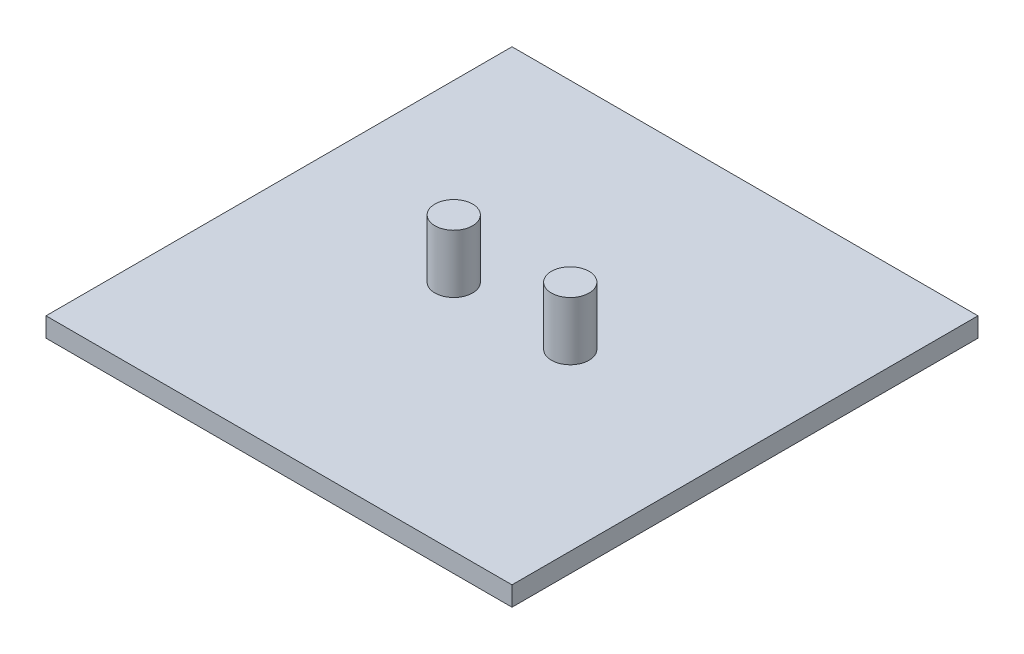
ISO-10303-21;
HEADER;
FILE_DESCRIPTION(('STEP AP214'),'2;1');
FILE_NAME('part.step','',(''),(''),'','','');
FILE_SCHEMA(('AUTOMOTIVE_DESIGN { 1 0 10303 214 1 1 1 1 }'));
ENDSEC;
DATA;
#1=APPLICATION_CONTEXT('core data for automotive mechanical design processes');
#2=APPLICATION_PROTOCOL_DEFINITION('international standard','automotive_design',2000,#1);
#3=PRODUCT_CONTEXT('',#1,'mechanical');
#4=PRODUCT('Part','Part','',(#3));
#5=PRODUCT_RELATED_PRODUCT_CATEGORY('part','',(#4));
#6=PRODUCT_DEFINITION_FORMATION('','',#4);
#7=PRODUCT_DEFINITION_CONTEXT('part definition',#1,'design');
#8=PRODUCT_DEFINITION('design','',#6,#7);
#9=PRODUCT_DEFINITION_SHAPE('','',#8);
#10=(LENGTH_UNIT() NAMED_UNIT(*) SI_UNIT(.MILLI.,.METRE.));
#11=(NAMED_UNIT(*) PLANE_ANGLE_UNIT() SI_UNIT($,.RADIAN.));
#12=(NAMED_UNIT(*) SI_UNIT($,.STERADIAN.) SOLID_ANGLE_UNIT());
#13=UNCERTAINTY_MEASURE_WITH_UNIT(LENGTH_MEASURE(1.E-05),#10,'distance_accuracy_value','');
#14=(GEOMETRIC_REPRESENTATION_CONTEXT(3) GLOBAL_UNCERTAINTY_ASSIGNED_CONTEXT((#13)) GLOBAL_UNIT_ASSIGNED_CONTEXT((#10,
#11,#12)) REPRESENTATION_CONTEXT('',''));
#15=CARTESIAN_POINT('',(0.,0.,0.));
#16=DIRECTION('',(0.,0.,1.));
#17=DIRECTION('',(1.,0.,0.));
#18=AXIS2_PLACEMENT_3D('',#15,#16,#17);
#19=CARTESIAN_POINT('',(0.,0.,0.));
#20=DIRECTION('',(0.,1.,0.));
#21=DIRECTION('',(0.,0.,1.));
#22=AXIS2_PLACEMENT_3D('',#19,#20,#21);
#23=PLANE('',#22);
#24=CARTESIAN_POINT('',(-7.5,0.,0.));
#25=DIRECTION('',(0.,1.,0.));
#26=DIRECTION('',(0.,0.,1.));
#27=AXIS2_PLACEMENT_3D('',#24,#25,#26);
#28=CIRCLE('',#27,2.425);
#29=CARTESIAN_POINT('',(-7.5,0.,2.425));
#30=VERTEX_POINT('',#29);
#31=EDGE_CURVE('E41',#30,#30,#28,.T.);
#32=ORIENTED_EDGE('',*,*,#31,.F.);
#33=EDGE_LOOP('',(#32));
#34=FACE_BOUND('',#33,.T.);
#35=DIRECTION('',(0.,0.,-1.));
#36=VECTOR('',#35,1.);
#37=CARTESIAN_POINT('',(30.,0.,-30.));
#38=LINE('',#37,#36);
#39=CARTESIAN_POINT('',(30.,0.,30.));
#40=VERTEX_POINT('',#39);
#41=CARTESIAN_POINT('',(30.,0.,-30.));
#42=VERTEX_POINT('',#41);
#43=EDGE_CURVE('E101',#40,#42,#38,.T.);
#44=ORIENTED_EDGE('',*,*,#43,.T.);
#45=DIRECTION('',(-1.,0.,0.));
#46=VECTOR('',#45,1.);
#47=CARTESIAN_POINT('',(-30.,0.,-30.));
#48=LINE('',#47,#46);
#49=CARTESIAN_POINT('',(-30.,0.,-30.));
#50=VERTEX_POINT('',#49);
#51=EDGE_CURVE('E104',#42,#50,#48,.T.);
#52=ORIENTED_EDGE('',*,*,#51,.T.);
#53=DIRECTION('',(0.,0.,1.));
#54=VECTOR('',#53,1.);
#55=CARTESIAN_POINT('',(-30.,0.,-30.));
#56=LINE('',#55,#54);
#57=CARTESIAN_POINT('',(-30.,0.,30.));
#58=VERTEX_POINT('',#57);
#59=EDGE_CURVE('E85',#50,#58,#56,.T.);
#60=ORIENTED_EDGE('',*,*,#59,.T.);
#61=DIRECTION('',(1.,0.,0.));
#62=VECTOR('',#61,1.);
#63=CARTESIAN_POINT('',(-30.,0.,30.));
#64=LINE('',#63,#62);
#65=EDGE_CURVE('E96',#58,#40,#64,.T.);
#66=ORIENTED_EDGE('',*,*,#65,.T.);
#67=EDGE_LOOP('',(#44,#52,#60,#66));
#68=FACE_BOUND('',#67,.T.);
#69=CARTESIAN_POINT('',(7.5,0.,0.));
#70=DIRECTION('',(0.,1.,0.));
#71=DIRECTION('',(0.,0.,1.));
#72=AXIS2_PLACEMENT_3D('',#69,#70,#71);
#73=CIRCLE('',#72,2.425);
#74=CARTESIAN_POINT('',(7.5,0.,2.425));
#75=VERTEX_POINT('',#74);
#76=EDGE_CURVE('E122',#75,#75,#73,.T.);
#77=ORIENTED_EDGE('',*,*,#76,.F.);
#78=EDGE_LOOP('',(#77));
#79=FACE_BOUND('',#78,.T.);
#80=ADVANCED_FACE('F32',(#34,#68,#79),#23,.T.);
#81=CARTESIAN_POINT('',(-7.5,7.5,0.));
#82=DIRECTION('',(0.,-1.,0.));
#83=DIRECTION('',(0.,0.,-1.));
#84=AXIS2_PLACEMENT_3D('',#81,#82,#83);
#85=CYLINDRICAL_SURFACE('',#84,2.425);
#86=CARTESIAN_POINT('',(-7.5,7.5,0.));
#87=DIRECTION('',(0.,1.,0.));
#88=DIRECTION('',(0.,0.,1.));
#89=AXIS2_PLACEMENT_3D('',#86,#87,#88);
#90=CIRCLE('',#89,2.425);
#91=CARTESIAN_POINT('',(-7.5,7.5,2.425));
#92=VERTEX_POINT('',#91);
#93=EDGE_CURVE('E11',#92,#92,#90,.T.);
#94=ORIENTED_EDGE('',*,*,#93,.F.);
#95=EDGE_LOOP('',(#94));
#96=FACE_BOUND('',#95,.T.);
#97=ORIENTED_EDGE('',*,*,#31,.T.);
#98=EDGE_LOOP('',(#97));
#99=FACE_BOUND('',#98,.T.);
#100=ADVANCED_FACE('F34',(#96,#99),#85,.T.);
#101=CARTESIAN_POINT('',(-7.5,7.5,0.));
#102=DIRECTION('',(0.,1.,0.));
#103=DIRECTION('',(0.,0.,1.));
#104=AXIS2_PLACEMENT_3D('',#101,#102,#103);
#105=PLANE('',#104);
#106=ORIENTED_EDGE('',*,*,#93,.T.);
#107=EDGE_LOOP('',(#106));
#108=FACE_BOUND('',#107,.T.);
#109=ADVANCED_FACE('F149',(#108),#105,.T.);
#110=CARTESIAN_POINT('',(30.,-2.5,-30.));
#111=DIRECTION('',(1.,0.,0.));
#112=DIRECTION('',(0.,0.,-1.));
#113=AXIS2_PLACEMENT_3D('',#110,#111,#112);
#114=PLANE('',#113);
#115=ORIENTED_EDGE('',*,*,#43,.F.);
#116=DIRECTION('',(0.,1.,0.));
#117=VECTOR('',#116,1.);
#118=CARTESIAN_POINT('',(30.,-2.5,30.));
#119=LINE('',#118,#117);
#120=CARTESIAN_POINT('',(30.,-2.5,30.));
#121=VERTEX_POINT('',#120);
#122=EDGE_CURVE('E49',#121,#40,#119,.T.);
#123=ORIENTED_EDGE('',*,*,#122,.F.);
#124=DIRECTION('',(0.,0.,-1.));
#125=VECTOR('',#124,1.);
#126=CARTESIAN_POINT('',(30.,-2.5,-30.));
#127=LINE('',#126,#125);
#128=CARTESIAN_POINT('',(30.,-2.5,-30.));
#129=VERTEX_POINT('',#128);
#130=EDGE_CURVE('E94',#121,#129,#127,.T.);
#131=ORIENTED_EDGE('',*,*,#130,.T.);
#132=DIRECTION('',(0.,1.,0.));
#133=VECTOR('',#132,1.);
#134=CARTESIAN_POINT('',(30.,-2.5,-30.));
#135=LINE('',#134,#133);
#136=EDGE_CURVE('E77',#129,#42,#135,.T.);
#137=ORIENTED_EDGE('',*,*,#136,.T.);
#138=EDGE_LOOP('',(#115,#123,#131,#137));
#139=FACE_BOUND('',#138,.T.);
#140=ADVANCED_FACE('F143',(#139),#114,.T.);
#141=CARTESIAN_POINT('',(-30.,-2.5,30.));
#142=DIRECTION('',(0.,0.,1.));
#143=DIRECTION('',(1.,0.,0.));
#144=AXIS2_PLACEMENT_3D('',#141,#142,#143);
#145=PLANE('',#144);
#146=ORIENTED_EDGE('',*,*,#65,.F.);
#147=DIRECTION('',(0.,1.,0.));
#148=VECTOR('',#147,1.);
#149=CARTESIAN_POINT('',(-30.,-2.5,30.));
#150=LINE('',#149,#148);
#151=CARTESIAN_POINT('',(-30.,-2.5,30.));
#152=VERTEX_POINT('',#151);
#153=EDGE_CURVE('E66',#152,#58,#150,.T.);
#154=ORIENTED_EDGE('',*,*,#153,.F.);
#155=DIRECTION('',(1.,0.,0.));
#156=VECTOR('',#155,1.);
#157=CARTESIAN_POINT('',(-30.,-2.5,30.));
#158=LINE('',#157,#156);
#159=EDGE_CURVE('E91',#152,#121,#158,.T.);
#160=ORIENTED_EDGE('',*,*,#159,.T.);
#161=ORIENTED_EDGE('',*,*,#122,.T.);
#162=EDGE_LOOP('',(#146,#154,#160,#161));
#163=FACE_BOUND('',#162,.T.);
#164=ADVANCED_FACE('F140',(#163),#145,.T.);
#165=CARTESIAN_POINT('',(-30.,-2.5,-30.));
#166=DIRECTION('',(-1.,0.,0.));
#167=DIRECTION('',(0.,0.,1.));
#168=AXIS2_PLACEMENT_3D('',#165,#166,#167);
#169=PLANE('',#168);
#170=ORIENTED_EDGE('',*,*,#59,.F.);
#171=DIRECTION('',(0.,1.,0.));
#172=VECTOR('',#171,1.);
#173=CARTESIAN_POINT('',(-30.,-2.5,-30.));
#174=LINE('',#173,#172);
#175=CARTESIAN_POINT('',(-30.,-2.5,-30.));
#176=VERTEX_POINT('',#175);
#177=EDGE_CURVE('E80',#176,#50,#174,.T.);
#178=ORIENTED_EDGE('',*,*,#177,.F.);
#179=DIRECTION('',(0.,0.,1.));
#180=VECTOR('',#179,1.);
#181=CARTESIAN_POINT('',(-30.,-2.5,-30.));
#182=LINE('',#181,#180);
#183=EDGE_CURVE('E83',#176,#152,#182,.T.);
#184=ORIENTED_EDGE('',*,*,#183,.T.);
#185=ORIENTED_EDGE('',*,*,#153,.T.);
#186=EDGE_LOOP('',(#170,#178,#184,#185));
#187=FACE_BOUND('',#186,.T.);
#188=ADVANCED_FACE('F82',(#187),#169,.T.);
#189=CARTESIAN_POINT('',(-30.,-2.5,-30.));
#190=DIRECTION('',(0.,0.,-1.));
#191=DIRECTION('',(-1.,0.,0.));
#192=AXIS2_PLACEMENT_3D('',#189,#190,#191);
#193=PLANE('',#192);
#194=ORIENTED_EDGE('',*,*,#51,.F.);
#195=ORIENTED_EDGE('',*,*,#136,.F.);
#196=DIRECTION('',(-1.,0.,0.));
#197=VECTOR('',#196,1.);
#198=CARTESIAN_POINT('',(-30.,-2.5,-30.));
#199=LINE('',#198,#197);
#200=EDGE_CURVE('E90',#129,#176,#199,.T.);
#201=ORIENTED_EDGE('',*,*,#200,.T.);
#202=ORIENTED_EDGE('',*,*,#177,.T.);
#203=EDGE_LOOP('',(#194,#195,#201,#202));
#204=FACE_BOUND('',#203,.T.);
#205=ADVANCED_FACE('F93',(#204),#193,.T.);
#206=CARTESIAN_POINT('',(0.,-2.5,0.));
#207=DIRECTION('',(0.,1.,0.));
#208=DIRECTION('',(0.,0.,1.));
#209=AXIS2_PLACEMENT_3D('',#206,#207,#208);
#210=PLANE('',#209);
#211=ORIENTED_EDGE('',*,*,#130,.F.);
#212=ORIENTED_EDGE('',*,*,#159,.F.);
#213=ORIENTED_EDGE('',*,*,#183,.F.);
#214=ORIENTED_EDGE('',*,*,#200,.F.);
#215=EDGE_LOOP('',(#211,#212,#213,#214));
#216=FACE_BOUND('',#215,.T.);
#217=ADVANCED_FACE('F89',(#216),#210,.F.);
#218=CARTESIAN_POINT('',(7.5,7.5,0.));
#219=DIRECTION('',(0.,-1.,0.));
#220=DIRECTION('',(0.,0.,-1.));
#221=AXIS2_PLACEMENT_3D('',#218,#219,#220);
#222=CYLINDRICAL_SURFACE('',#221,2.425);
#223=CARTESIAN_POINT('',(7.5,7.5,0.));
#224=DIRECTION('',(0.,1.,0.));
#225=DIRECTION('',(0.,0.,1.));
#226=AXIS2_PLACEMENT_3D('',#223,#224,#225);
#227=CIRCLE('',#226,2.425);
#228=CARTESIAN_POINT('',(7.5,7.5,2.425));
#229=VERTEX_POINT('',#228);
#230=EDGE_CURVE('E105',#229,#229,#227,.T.);
#231=ORIENTED_EDGE('',*,*,#230,.F.);
#232=EDGE_LOOP('',(#231));
#233=FACE_BOUND('',#232,.T.);
#234=ORIENTED_EDGE('',*,*,#76,.T.);
#235=EDGE_LOOP('',(#234));
#236=FACE_BOUND('',#235,.T.);
#237=ADVANCED_FACE('F130',(#233,#236),#222,.T.);
#238=CARTESIAN_POINT('',(7.5,7.5,0.));
#239=DIRECTION('',(0.,1.,0.));
#240=DIRECTION('',(0.,0.,1.));
#241=AXIS2_PLACEMENT_3D('',#238,#239,#240);
#242=PLANE('',#241);
#243=ORIENTED_EDGE('',*,*,#230,.T.);
#244=EDGE_LOOP('',(#243));
#245=FACE_BOUND('',#244,.T.);
#246=ADVANCED_FACE('F128',(#245),#242,.T.);
#247=CLOSED_SHELL('',(#80,#100,#109,#140,#164,#188,#205,#217,#237,#246));
#248=MANIFOLD_SOLID_BREP('B2',#247);
#249=ADVANCED_BREP_SHAPE_REPRESENTATION('',(#18,#248),#14);
#250=SHAPE_DEFINITION_REPRESENTATION(#9,#249);
ENDSEC;
END-ISO-10303-21;
